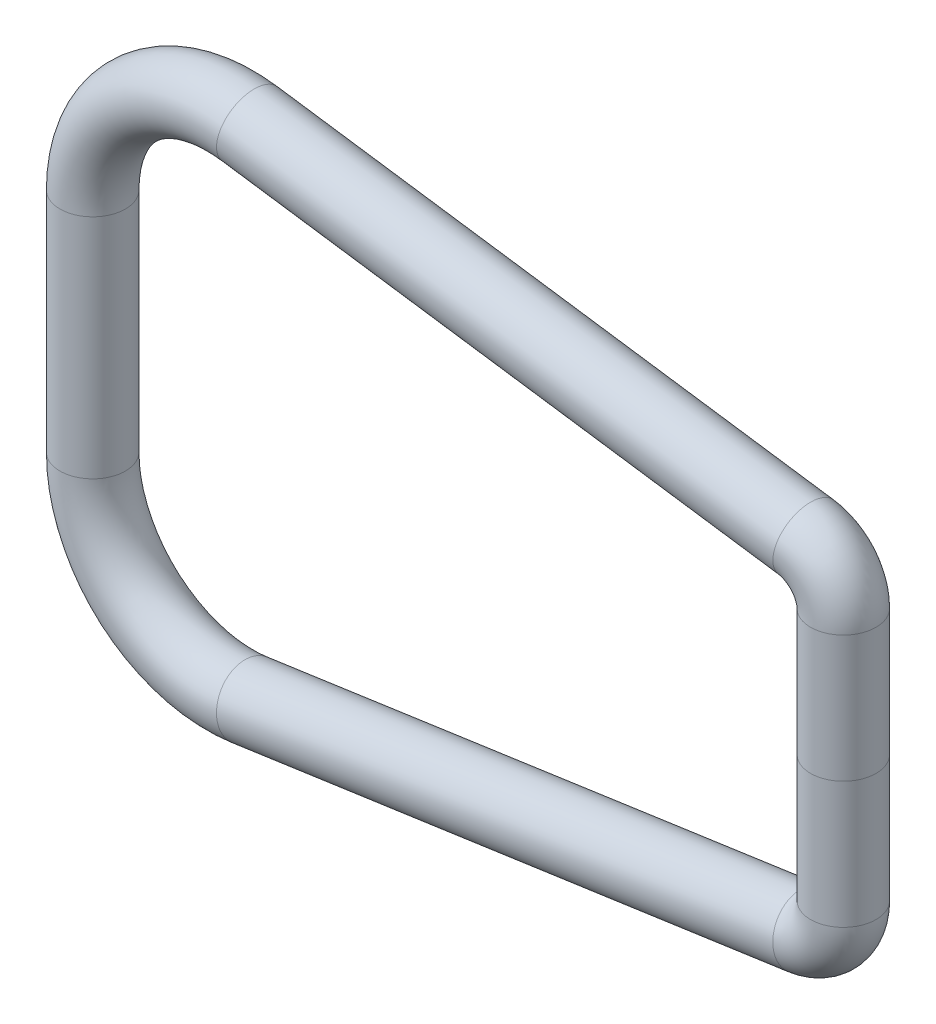
ISO-10303-21;
HEADER;
FILE_DESCRIPTION(('STEP AP214'),'2;1');
FILE_NAME('part.step','',(''),(''),'','','');
FILE_SCHEMA(('AUTOMOTIVE_DESIGN { 1 0 10303 214 1 1 1 1 }'));
ENDSEC;
DATA;
#1=APPLICATION_CONTEXT('core data for automotive mechanical design processes');
#2=APPLICATION_PROTOCOL_DEFINITION('international standard','automotive_design',2000,#1);
#3=PRODUCT_CONTEXT('',#1,'mechanical');
#4=PRODUCT('Part','Part','',(#3));
#5=PRODUCT_RELATED_PRODUCT_CATEGORY('part','',(#4));
#6=PRODUCT_DEFINITION_FORMATION('','',#4);
#7=PRODUCT_DEFINITION_CONTEXT('part definition',#1,'design');
#8=PRODUCT_DEFINITION('design','',#6,#7);
#9=PRODUCT_DEFINITION_SHAPE('','',#8);
#10=(LENGTH_UNIT() NAMED_UNIT(*) SI_UNIT(.MILLI.,.METRE.));
#11=(NAMED_UNIT(*) PLANE_ANGLE_UNIT() SI_UNIT($,.RADIAN.));
#12=(NAMED_UNIT(*) SI_UNIT($,.STERADIAN.) SOLID_ANGLE_UNIT());
#13=UNCERTAINTY_MEASURE_WITH_UNIT(LENGTH_MEASURE(1.E-05),#10,'distance_accuracy_value','');
#14=(GEOMETRIC_REPRESENTATION_CONTEXT(3) GLOBAL_UNCERTAINTY_ASSIGNED_CONTEXT((#13)) GLOBAL_UNIT_ASSIGNED_CONTEXT((#10,
#11,#12)) REPRESENTATION_CONTEXT('',''));
#15=CARTESIAN_POINT('',(0.,0.,0.));
#16=DIRECTION('',(0.,0.,1.));
#17=DIRECTION('',(1.,0.,0.));
#18=AXIS2_PLACEMENT_3D('',#15,#16,#17);
#19=CARTESIAN_POINT('',(0.,0.,0.));
#20=DIRECTION('',(0.,-1.,0.));
#21=DIRECTION('',(1.,0.,0.));
#22=AXIS2_PLACEMENT_3D('',#19,#20,#21);
#23=CYLINDRICAL_SURFACE('',#22,0.9525);
#24=CARTESIAN_POINT('',(0.,-3.683,0.));
#25=DIRECTION('',(0.,1.,0.));
#26=DIRECTION('',(0.,0.,1.));
#27=AXIS2_PLACEMENT_3D('',#24,#25,#26);
#28=CIRCLE('',#27,0.9525);
#29=CARTESIAN_POINT('',(0.952499999999999,-3.683,0.));
#30=VERTEX_POINT('',#29);
#31=EDGE_CURVE('E66',#30,#30,#28,.T.);
#32=ORIENTED_EDGE('',*,*,#31,.T.);
#33=EDGE_LOOP('',(#32));
#34=FACE_BOUND('',#33,.T.);
#35=CARTESIAN_POINT('',(0.,0.,0.));
#36=DIRECTION('',(0.,1.,0.));
#37=DIRECTION('',(0.,0.,1.));
#38=AXIS2_PLACEMENT_3D('',#35,#36,#37);
#39=CIRCLE('',#38,0.9525);
#40=CARTESIAN_POINT('',(0.9525,0.,0.));
#41=VERTEX_POINT('',#40);
#42=EDGE_CURVE('E69',#41,#41,#39,.T.);
#43=ORIENTED_EDGE('',*,*,#42,.F.);
#44=EDGE_LOOP('',(#43));
#45=FACE_BOUND('',#44,.T.);
#46=ADVANCED_FACE('F37',(#34,#45),#23,.T.);
#47=CARTESIAN_POINT('',(-1.27,-3.683,0.));
#48=DIRECTION('',(0.,0.,-1.));
#49=DIRECTION('',(-1.,0.,0.));
#50=AXIS2_PLACEMENT_3D('',#47,#48,#49);
#51=TOROIDAL_SURFACE('',#50,1.27,0.9525);
#52=CARTESIAN_POINT('',(-1.08988138833314,-4.94016239433543,0.));
#53=DIRECTION('',(0.98989164908302,0.14182567847784,0.));
#54=DIRECTION('',(0.,0.,1.));
#55=AXIS2_PLACEMENT_3D('',#52,#53,#54);
#56=CIRCLE('',#55,0.9525);
#57=CARTESIAN_POINT('',(-0.954792429583002,-5.88303419008701,0.));
#58=VERTEX_POINT('',#57);
#59=EDGE_CURVE('E63',#58,#58,#56,.T.);
#60=CARTESIAN_POINT('',(-1.27,-3.683,0.));
#61=DIRECTION('',(0.,0.,-1.));
#62=DIRECTION('',(-1.,0.,0.));
#63=AXIS2_PLACEMENT_3D('',#60,#61,#62);
#64=CIRCLE('',#63,2.2225);
#65=EDGE_CURVE('',#30,#58,#64,.T.);
#66=ORIENTED_EDGE('',*,*,#31,.F.);
#67=ORIENTED_EDGE('',*,*,#59,.T.);
#68=ORIENTED_EDGE('',*,*,#65,.T.);
#69=ORIENTED_EDGE('',*,*,#65,.F.);
#70=EDGE_LOOP('',(#66,#68,#67,#69));
#71=FACE_BOUND('',#70,.T.);
#72=ADVANCED_FACE('F76',(#71),#51,.T.);
#73=CARTESIAN_POINT('',(-1.08988138833314,-4.94016239433543,0.));
#74=DIRECTION('',(-0.98989164908302,-0.141825678477839,0.));
#75=DIRECTION('',(0.141825678477839,-0.98989164908302,0.));
#76=AXIS2_PLACEMENT_3D('',#73,#74,#75);
#77=CYLINDRICAL_SURFACE('',#76,0.9525);
#78=CARTESIAN_POINT('',(-17.2789297726963,-7.25963116968047,0.));
#79=DIRECTION('',(0.98989164908302,0.141825678477839,0.));
#80=DIRECTION('',(0.,0.,1.));
#81=AXIS2_PLACEMENT_3D('',#78,#79,#80);
#82=CIRCLE('',#81,0.9525);
#83=CARTESIAN_POINT('',(-17.1438408139462,-8.20250296543204,0.));
#84=VERTEX_POINT('',#83);
#85=EDGE_CURVE('E60',#84,#84,#82,.T.);
#86=ORIENTED_EDGE('',*,*,#85,.T.);
#87=EDGE_LOOP('',(#86));
#88=FACE_BOUND('',#87,.T.);
#89=ORIENTED_EDGE('',*,*,#59,.F.);
#90=EDGE_LOOP('',(#89));
#91=FACE_BOUND('',#90,.T.);
#92=ADVANCED_FACE('F82',(#88,#91),#77,.T.);
#93=CARTESIAN_POINT('',(-17.8459551904023,-3.302,0.));
#94=DIRECTION('',(0.,0.,-1.));
#95=DIRECTION('',(-1.,0.,0.));
#96=AXIS2_PLACEMENT_3D('',#93,#94,#95);
#97=TOROIDAL_SURFACE('',#96,3.99804480959769,0.9525);
#98=CARTESIAN_POINT('',(-21.844,-3.302,0.));
#99=DIRECTION('',(0.,-1.,0.));
#100=DIRECTION('',(0.,0.,1.));
#101=AXIS2_PLACEMENT_3D('',#98,#99,#100);
#102=CIRCLE('',#101,0.9525);
#103=CARTESIAN_POINT('',(-22.7965,-3.302,0.));
#104=VERTEX_POINT('',#103);
#105=EDGE_CURVE('E57',#104,#104,#102,.T.);
#106=CARTESIAN_POINT('',(-17.8459551904023,-3.302,0.));
#107=DIRECTION('',(0.,0.,-1.));
#108=DIRECTION('',(-1.,0.,0.));
#109=AXIS2_PLACEMENT_3D('',#106,#107,#108);
#110=CIRCLE('',#109,4.95054480959769);
#111=EDGE_CURVE('',#84,#104,#110,.T.);
#112=ORIENTED_EDGE('',*,*,#85,.F.);
#113=ORIENTED_EDGE('',*,*,#105,.T.);
#114=ORIENTED_EDGE('',*,*,#111,.T.);
#115=ORIENTED_EDGE('',*,*,#111,.F.);
#116=EDGE_LOOP('',(#112,#114,#113,#115));
#117=FACE_BOUND('',#116,.T.);
#118=ADVANCED_FACE('F88',(#117),#97,.T.);
#119=CARTESIAN_POINT('',(-21.844,-3.302,0.));
#120=DIRECTION('',(0.,1.,0.));
#121=DIRECTION('',(0.,0.,1.));
#122=AXIS2_PLACEMENT_3D('',#119,#120,#121);
#123=CYLINDRICAL_SURFACE('',#122,0.9525);
#124=CARTESIAN_POINT('',(-21.844,3.302,0.));
#125=DIRECTION('',(0.,-1.,0.));
#126=DIRECTION('',(0.,0.,1.));
#127=AXIS2_PLACEMENT_3D('',#124,#125,#126);
#128=CIRCLE('',#127,0.9525);
#129=CARTESIAN_POINT('',(-22.7965,3.302,0.));
#130=VERTEX_POINT('',#129);
#131=EDGE_CURVE('E52',#130,#130,#128,.T.);
#132=ORIENTED_EDGE('',*,*,#131,.T.);
#133=EDGE_LOOP('',(#132));
#134=FACE_BOUND('',#133,.T.);
#135=ORIENTED_EDGE('',*,*,#105,.F.);
#136=EDGE_LOOP('',(#135));
#137=FACE_BOUND('',#136,.T.);
#138=ADVANCED_FACE('F92',(#134,#137),#123,.T.);
#139=CARTESIAN_POINT('',(-17.8459551904023,3.302,0.));
#140=DIRECTION('',(0.,0.,-1.));
#141=DIRECTION('',(-1.,0.,0.));
#142=AXIS2_PLACEMENT_3D('',#139,#140,#141);
#143=TOROIDAL_SURFACE('',#142,3.99804480959769,0.9525);
#144=CARTESIAN_POINT('',(-17.2789297726963,7.25963116968047,0.));
#145=DIRECTION('',(-0.98989164908302,0.14182567847784,0.));
#146=DIRECTION('',(0.,0.,1.));
#147=AXIS2_PLACEMENT_3D('',#144,#145,#146);
#148=CIRCLE('',#147,0.9525);
#149=CARTESIAN_POINT('',(-17.1438408139462,8.20250296543204,0.));
#150=VERTEX_POINT('',#149);
#151=EDGE_CURVE('E48',#150,#150,#148,.T.);
#152=CARTESIAN_POINT('',(-17.8459551904023,3.302,0.));
#153=DIRECTION('',(0.,0.,-1.));
#154=DIRECTION('',(-1.,0.,0.));
#155=AXIS2_PLACEMENT_3D('',#152,#153,#154);
#156=CIRCLE('',#155,4.95054480959769);
#157=EDGE_CURVE('',#130,#150,#156,.T.);
#158=ORIENTED_EDGE('',*,*,#131,.F.);
#159=ORIENTED_EDGE('',*,*,#151,.T.);
#160=ORIENTED_EDGE('',*,*,#157,.T.);
#161=ORIENTED_EDGE('',*,*,#157,.F.);
#162=EDGE_LOOP('',(#158,#160,#159,#161));
#163=FACE_BOUND('',#162,.T.);
#164=ADVANCED_FACE('F96',(#163),#143,.T.);
#165=CARTESIAN_POINT('',(-17.2789297726963,7.25963116968047,0.));
#166=DIRECTION('',(0.98989164908302,-0.141825678477839,0.));
#167=DIRECTION('',(0.141825678477839,0.98989164908302,0.));
#168=AXIS2_PLACEMENT_3D('',#165,#166,#167);
#169=CYLINDRICAL_SURFACE('',#168,0.9525);
#170=CARTESIAN_POINT('',(-1.08988138833314,4.94016239433543,0.));
#171=DIRECTION('',(-0.98989164908302,0.141825678477839,0.));
#172=DIRECTION('',(0.,0.,1.));
#173=AXIS2_PLACEMENT_3D('',#170,#171,#172);
#174=CIRCLE('',#173,0.9525);
#175=CARTESIAN_POINT('',(-0.954792429582991,5.88303419008701,0.));
#176=VERTEX_POINT('',#175);
#177=EDGE_CURVE('E44',#176,#176,#174,.T.);
#178=ORIENTED_EDGE('',*,*,#177,.T.);
#179=EDGE_LOOP('',(#178));
#180=FACE_BOUND('',#179,.T.);
#181=ORIENTED_EDGE('',*,*,#151,.F.);
#182=EDGE_LOOP('',(#181));
#183=FACE_BOUND('',#182,.T.);
#184=ADVANCED_FACE('F100',(#180,#183),#169,.T.);
#185=CARTESIAN_POINT('',(-1.27,3.683,0.));
#186=DIRECTION('',(0.,0.,-1.));
#187=DIRECTION('',(-1.,0.,0.));
#188=AXIS2_PLACEMENT_3D('',#185,#186,#187);
#189=TOROIDAL_SURFACE('',#188,1.27,0.9525);
#190=CARTESIAN_POINT('',(0.,3.683,0.));
#191=DIRECTION('',(0.,1.,0.));
#192=DIRECTION('',(0.,0.,1.));
#193=AXIS2_PLACEMENT_3D('',#190,#191,#192);
#194=CIRCLE('',#193,0.9525);
#195=CARTESIAN_POINT('',(0.952500000000001,3.683,0.));
#196=VERTEX_POINT('',#195);
#197=EDGE_CURVE('E10',#196,#196,#194,.T.);
#198=CARTESIAN_POINT('',(-1.27,3.683,0.));
#199=DIRECTION('',(0.,0.,-1.));
#200=DIRECTION('',(-1.,0.,0.));
#201=AXIS2_PLACEMENT_3D('',#198,#199,#200);
#202=CIRCLE('',#201,2.2225);
#203=EDGE_CURVE('',#176,#196,#202,.T.);
#204=ORIENTED_EDGE('',*,*,#177,.F.);
#205=ORIENTED_EDGE('',*,*,#197,.T.);
#206=ORIENTED_EDGE('',*,*,#203,.T.);
#207=ORIENTED_EDGE('',*,*,#203,.F.);
#208=EDGE_LOOP('',(#204,#206,#205,#207));
#209=FACE_BOUND('',#208,.T.);
#210=ADVANCED_FACE('F103',(#209),#189,.T.);
#211=CARTESIAN_POINT('',(0.,3.683,0.));
#212=DIRECTION('',(0.,-1.,0.));
#213=DIRECTION('',(1.,0.,0.));
#214=AXIS2_PLACEMENT_3D('',#211,#212,#213);
#215=CYLINDRICAL_SURFACE('',#214,0.9525);
#216=CARTESIAN_POINT('',(0.9525,0.,0.));
#217=CARTESIAN_POINT('',(0.9525,0.0383645833333328,0.));
#218=CARTESIAN_POINT('',(0.9525,0.0767291666666661,0.));
#219=CARTESIAN_POINT('',(0.9525,0.153458333333333,0.));
#220=CARTESIAN_POINT('',(0.9525,0.191822916666666,0.));
#221=CARTESIAN_POINT('',(0.9525,0.268552083333333,0.));
#222=CARTESIAN_POINT('',(0.9525,0.306916666666666,0.));
#223=CARTESIAN_POINT('',(0.9525,0.383645833333333,0.));
#224=CARTESIAN_POINT('',(0.9525,0.422010416666666,0.));
#225=CARTESIAN_POINT('',(0.9525,0.498739583333333,0.));
#226=CARTESIAN_POINT('',(0.9525,0.537104166666666,0.));
#227=CARTESIAN_POINT('',(0.9525,0.613833333333333,0.));
#228=CARTESIAN_POINT('',(0.9525,0.652197916666666,0.));
#229=CARTESIAN_POINT('',(0.9525,0.728927083333333,0.));
#230=CARTESIAN_POINT('',(0.9525,0.767291666666666,0.));
#231=CARTESIAN_POINT('',(0.9525,0.844020833333333,0.));
#232=CARTESIAN_POINT('',(0.9525,0.882385416666666,0.));
#233=CARTESIAN_POINT('',(0.9525,0.959114583333333,0.));
#234=CARTESIAN_POINT('',(0.9525,0.997479166666666,0.));
#235=CARTESIAN_POINT('',(0.9525,1.07420833333333,0.));
#236=CARTESIAN_POINT('',(0.9525,1.11257291666667,0.));
#237=CARTESIAN_POINT('',(0.9525,1.18930208333333,0.));
#238=CARTESIAN_POINT('',(0.9525,1.22766666666667,0.));
#239=CARTESIAN_POINT('',(0.9525,1.30439583333333,0.));
#240=CARTESIAN_POINT('',(0.9525,1.34276041666667,0.));
#241=CARTESIAN_POINT('',(0.9525,1.41948958333333,0.));
#242=CARTESIAN_POINT('',(0.9525,1.45785416666667,0.));
#243=CARTESIAN_POINT('',(0.9525,1.53458333333333,0.));
#244=CARTESIAN_POINT('',(0.9525,1.57294791666667,0.));
#245=CARTESIAN_POINT('',(0.9525,1.64967708333333,0.));
#246=CARTESIAN_POINT('',(0.9525,1.68804166666667,0.));
#247=CARTESIAN_POINT('',(0.9525,1.76477083333333,0.));
#248=CARTESIAN_POINT('',(0.9525,1.80313541666667,0.));
#249=CARTESIAN_POINT('',(0.9525,1.87986458333333,0.));
#250=CARTESIAN_POINT('',(0.9525,1.91822916666667,0.));
#251=CARTESIAN_POINT('',(0.9525,1.99495833333333,0.));
#252=CARTESIAN_POINT('',(0.9525,2.03332291666667,0.));
#253=CARTESIAN_POINT('',(0.9525,2.11005208333333,0.));
#254=CARTESIAN_POINT('',(0.9525,2.14841666666667,0.));
#255=CARTESIAN_POINT('',(0.9525,2.22514583333333,0.));
#256=CARTESIAN_POINT('',(0.9525,2.26351041666666,0.));
#257=CARTESIAN_POINT('',(0.9525,2.34023958333333,0.));
#258=CARTESIAN_POINT('',(0.9525,2.37860416666666,0.));
#259=CARTESIAN_POINT('',(0.9525,2.45533333333333,0.));
#260=CARTESIAN_POINT('',(0.9525,2.49369791666667,0.));
#261=CARTESIAN_POINT('',(0.9525,2.57042708333333,0.));
#262=CARTESIAN_POINT('',(0.9525,2.60879166666667,0.));
#263=CARTESIAN_POINT('',(0.9525,2.68552083333333,0.));
#264=CARTESIAN_POINT('',(0.9525,2.72388541666666,0.));
#265=CARTESIAN_POINT('',(0.9525,2.80061458333333,0.));
#266=CARTESIAN_POINT('',(0.9525,2.83897916666666,0.));
#267=CARTESIAN_POINT('',(0.9525,2.91570833333333,0.));
#268=CARTESIAN_POINT('',(0.9525,2.95407291666666,0.));
#269=CARTESIAN_POINT('',(0.9525,3.03080208333333,0.));
#270=CARTESIAN_POINT('',(0.9525,3.06916666666667,0.));
#271=CARTESIAN_POINT('',(0.9525,3.14589583333333,0.));
#272=CARTESIAN_POINT('',(0.9525,3.18426041666666,0.));
#273=CARTESIAN_POINT('',(0.9525,3.26098958333333,0.));
#274=CARTESIAN_POINT('',(0.9525,3.29935416666666,0.));
#275=CARTESIAN_POINT('',(0.9525,3.37608333333333,0.));
#276=CARTESIAN_POINT('',(0.952500000000001,3.41444791666666,0.));
#277=CARTESIAN_POINT('',(0.952500000000001,3.49117708333333,0.));
#278=CARTESIAN_POINT('',(0.952500000000001,3.52954166666666,0.));
#279=CARTESIAN_POINT('',(0.952500000000001,3.60627083333333,0.));
#280=CARTESIAN_POINT('',(0.952500000000001,3.64463541666666,0.));
#281=CARTESIAN_POINT('',(0.952500000000001,3.683,0.));
#282=B_SPLINE_CURVE_WITH_KNOTS('',3,(#216,#217,#218,#219,#220,#221,#222,#223,#224,#225,#226,
#227,#228,#229,#230,#231,#232,#233,#234,#235,#236,#237,#238,#239,#240,#241,#242,#243,#244,#245,
#246,#247,#248,#249,#250,#251,#252,#253,#254,#255,#256,#257,#258,#259,#260,#261,#262,#263,#264,
#265,#266,#267,#268,#269,#270,#271,#272,#273,#274,#275,#276,#277,#278,#279,#280,#281),
.UNSPECIFIED.,.F.,.F.,(4,2,2,2,2,2,2,2,2,2,2,2,2,2,2,2,2,2,2,2,2,2,2,2,2,2,2,2,2,2,2,2,4),(0.,
0.11509375,0.2301875,0.34528125,0.460375,0.57546875,0.6905625,0.80565625,0.92075,1.03584375,
1.1509375,1.26603125,1.381125,1.49621875,1.6113125,1.72640625,1.8415,1.95659375,2.0716875,
2.18678125,2.301875,2.41696875,2.5320625,2.64715625,2.76225,2.87734375,2.9924375,3.10753125,
3.222625,3.33771875,3.4528125,3.56790625,3.683),.UNSPECIFIED.);
#283=EDGE_CURVE('BSEAM39',#41,#196,#282,.T.);
#284=ORIENTED_EDGE('',*,*,#42,.T.);
#285=ORIENTED_EDGE('',*,*,#197,.F.);
#286=ORIENTED_EDGE('',*,*,#283,.T.);
#287=ORIENTED_EDGE('',*,*,#283,.F.);
#288=EDGE_LOOP('',(#284,#286,#285,#287));
#289=FACE_BOUND('',#288,.T.);
#290=ADVANCED_FACE('F39',(#289),#215,.T.);
#291=CLOSED_SHELL('',(#46,#72,#92,#118,#138,#164,#184,#210,#290));
#292=MANIFOLD_SOLID_BREP('B2',#291);
#293=ADVANCED_BREP_SHAPE_REPRESENTATION('',(#18,#292),#14);
#294=SHAPE_DEFINITION_REPRESENTATION(#9,#293);
ENDSEC;
END-ISO-10303-21;
